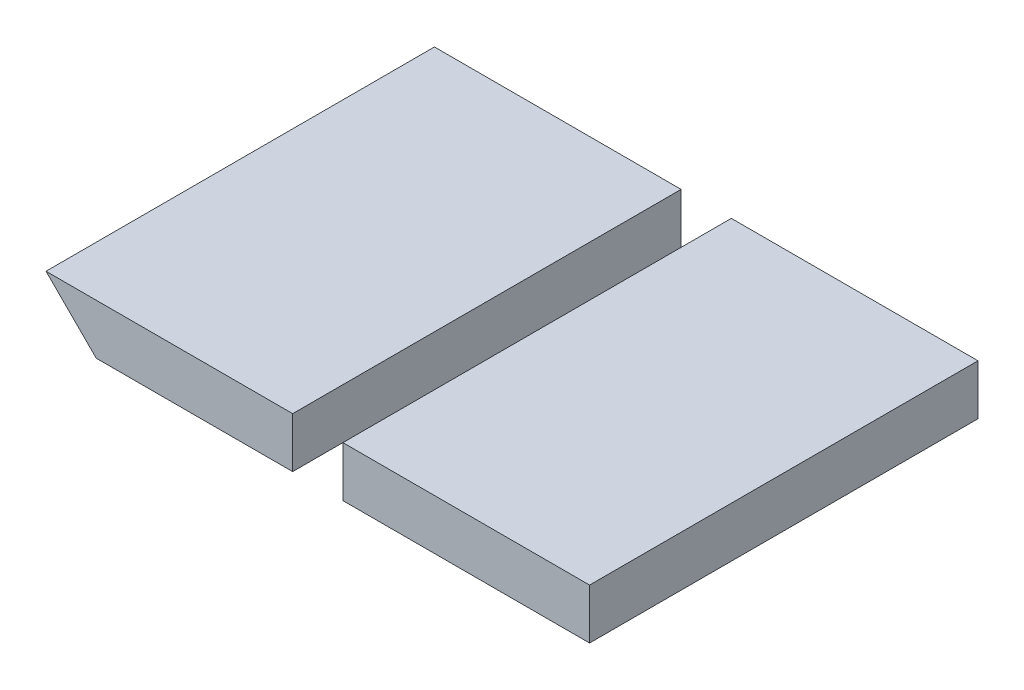
ISO-10303-21;
HEADER;
FILE_DESCRIPTION(('STEP AP214'),'2;1');
FILE_NAME('part.step','',(''),(''),'','','');
FILE_SCHEMA(('AUTOMOTIVE_DESIGN { 1 0 10303 214 1 1 1 1 }'));
ENDSEC;
DATA;
#1=APPLICATION_CONTEXT('core data for automotive mechanical design processes');
#2=APPLICATION_PROTOCOL_DEFINITION('international standard','automotive_design',2000,#1);
#3=PRODUCT_CONTEXT('',#1,'mechanical');
#4=PRODUCT('Part','Part','',(#3));
#5=PRODUCT_RELATED_PRODUCT_CATEGORY('part','',(#4));
#6=PRODUCT_DEFINITION_FORMATION('','',#4);
#7=PRODUCT_DEFINITION_CONTEXT('part definition',#1,'design');
#8=PRODUCT_DEFINITION('design','',#6,#7);
#9=PRODUCT_DEFINITION_SHAPE('','',#8);
#10=(LENGTH_UNIT() NAMED_UNIT(*) SI_UNIT(.MILLI.,.METRE.));
#11=(NAMED_UNIT(*) PLANE_ANGLE_UNIT() SI_UNIT($,.RADIAN.));
#12=(NAMED_UNIT(*) SI_UNIT($,.STERADIAN.) SOLID_ANGLE_UNIT());
#13=UNCERTAINTY_MEASURE_WITH_UNIT(LENGTH_MEASURE(1.E-05),#10,'distance_accuracy_value','');
#14=(GEOMETRIC_REPRESENTATION_CONTEXT(3) GLOBAL_UNCERTAINTY_ASSIGNED_CONTEXT((#13)) GLOBAL_UNIT_ASSIGNED_CONTEXT((#10,
#11,#12)) REPRESENTATION_CONTEXT('',''));
#15=CARTESIAN_POINT('',(0.,0.,0.));
#16=DIRECTION('',(0.,0.,1.));
#17=DIRECTION('',(1.,0.,0.));
#18=AXIS2_PLACEMENT_3D('',#15,#16,#17);
#19=CARTESIAN_POINT('',(6.34999999999997,0.,20.));
#20=DIRECTION('',(1.,0.,0.));
#21=DIRECTION('',(0.,1.,0.));
#22=AXIS2_PLACEMENT_3D('',#19,#20,#21);
#23=PLANE('',#22);
#24=DIRECTION('',(0.,-1.,0.));
#25=VECTOR('',#24,1.);
#26=CARTESIAN_POINT('',(6.34999999999997,0.,0.));
#27=LINE('',#26,#25);
#28=CARTESIAN_POINT('',(6.35,21.6361,0.));
#29=VERTEX_POINT('',#28);
#30=CARTESIAN_POINT('',(6.35,19.05,0.));
#31=VERTEX_POINT('',#30);
#32=EDGE_CURVE('E120',#29,#31,#27,.T.);
#33=ORIENTED_EDGE('',*,*,#32,.F.);
#34=DIRECTION('',(0.,0.,-1.));
#35=VECTOR('',#34,1.);
#36=CARTESIAN_POINT('',(6.35,21.6361,20.));
#37=LINE('',#36,#35);
#38=CARTESIAN_POINT('',(6.35,21.6361,20.));
#39=VERTEX_POINT('',#38);
#40=EDGE_CURVE('E12',#39,#29,#37,.T.);
#41=ORIENTED_EDGE('',*,*,#40,.F.);
#42=DIRECTION('',(0.,-1.,0.));
#43=VECTOR('',#42,1.);
#44=CARTESIAN_POINT('',(6.34999999999997,0.,20.));
#45=LINE('',#44,#43);
#46=CARTESIAN_POINT('',(6.35,19.05,20.));
#47=VERTEX_POINT('',#46);
#48=EDGE_CURVE('E110',#39,#47,#45,.T.);
#49=ORIENTED_EDGE('',*,*,#48,.T.);
#50=DIRECTION('',(0.,0.,-1.));
#51=VECTOR('',#50,1.);
#52=CARTESIAN_POINT('',(6.35,19.05,20.));
#53=LINE('',#52,#51);
#54=EDGE_CURVE('E91',#47,#31,#53,.T.);
#55=ORIENTED_EDGE('',*,*,#54,.T.);
#56=EDGE_LOOP('',(#33,#41,#49,#55));
#57=FACE_BOUND('',#56,.T.);
#58=ADVANCED_FACE('F52',(#57),#23,.T.);
#59=CARTESIAN_POINT('',(0.,21.6361,20.));
#60=DIRECTION('',(0.,1.,0.));
#61=DIRECTION('',(-1.,0.,0.));
#62=AXIS2_PLACEMENT_3D('',#59,#60,#61);
#63=PLANE('',#62);
#64=DIRECTION('',(1.,0.,0.));
#65=VECTOR('',#64,1.);
#66=CARTESIAN_POINT('',(0.,21.6361,0.));
#67=LINE('',#66,#65);
#68=CARTESIAN_POINT('',(-6.35,21.6361,0.));
#69=VERTEX_POINT('',#68);
#70=EDGE_CURVE('E102',#69,#29,#67,.T.);
#71=ORIENTED_EDGE('',*,*,#70,.F.);
#72=DIRECTION('',(0.,0.,-1.));
#73=VECTOR('',#72,1.);
#74=CARTESIAN_POINT('',(-6.35,21.6361,20.));
#75=LINE('',#74,#73);
#76=CARTESIAN_POINT('',(-6.35,21.6361,20.));
#77=VERTEX_POINT('',#76);
#78=EDGE_CURVE('E61',#77,#69,#75,.T.);
#79=ORIENTED_EDGE('',*,*,#78,.F.);
#80=DIRECTION('',(1.,0.,0.));
#81=VECTOR('',#80,1.);
#82=CARTESIAN_POINT('',(0.,21.6361,20.));
#83=LINE('',#82,#81);
#84=EDGE_CURVE('E100',#77,#39,#83,.T.);
#85=ORIENTED_EDGE('',*,*,#84,.T.);
#86=ORIENTED_EDGE('',*,*,#40,.T.);
#87=EDGE_LOOP('',(#71,#79,#85,#86));
#88=FACE_BOUND('',#87,.T.);
#89=ADVANCED_FACE('F99',(#88),#63,.T.);
#90=CARTESIAN_POINT('',(-6.35000000000002,0.,20.));
#91=DIRECTION('',(-1.,0.,0.));
#92=DIRECTION('',(0.,-1.,0.));
#93=AXIS2_PLACEMENT_3D('',#90,#91,#92);
#94=PLANE('',#93);
#95=DIRECTION('',(0.,1.,0.));
#96=VECTOR('',#95,1.);
#97=CARTESIAN_POINT('',(-6.35000000000002,0.,0.));
#98=LINE('',#97,#96);
#99=CARTESIAN_POINT('',(-6.35,19.05,0.));
#100=VERTEX_POINT('',#99);
#101=EDGE_CURVE('E126',#100,#69,#98,.T.);
#102=ORIENTED_EDGE('',*,*,#101,.F.);
#103=DIRECTION('',(0.,0.,-1.));
#104=VECTOR('',#103,1.);
#105=CARTESIAN_POINT('',(-6.35,19.05,20.));
#106=LINE('',#105,#104);
#107=CARTESIAN_POINT('',(-6.35,19.05,20.));
#108=VERTEX_POINT('',#107);
#109=EDGE_CURVE('E84',#108,#100,#106,.T.);
#110=ORIENTED_EDGE('',*,*,#109,.F.);
#111=DIRECTION('',(0.,1.,0.));
#112=VECTOR('',#111,1.);
#113=CARTESIAN_POINT('',(-6.35000000000002,0.,20.));
#114=LINE('',#113,#112);
#115=EDGE_CURVE('E109',#108,#77,#114,.T.);
#116=ORIENTED_EDGE('',*,*,#115,.T.);
#117=ORIENTED_EDGE('',*,*,#78,.T.);
#118=EDGE_LOOP('',(#102,#110,#116,#117));
#119=FACE_BOUND('',#118,.T.);
#120=ADVANCED_FACE('F113',(#119),#94,.T.);
#121=CARTESIAN_POINT('',(0.,19.05,20.));
#122=DIRECTION('',(0.,1.,0.));
#123=DIRECTION('',(0.,0.,1.));
#124=AXIS2_PLACEMENT_3D('',#121,#122,#123);
#125=PLANE('',#124);
#126=DIRECTION('',(1.,0.,0.));
#127=VECTOR('',#126,1.);
#128=CARTESIAN_POINT('',(0.,19.05,0.));
#129=LINE('',#128,#127);
#130=EDGE_CURVE('E129',#100,#31,#129,.T.);
#131=ORIENTED_EDGE('',*,*,#130,.T.);
#132=ORIENTED_EDGE('',*,*,#54,.F.);
#133=DIRECTION('',(1.,0.,0.));
#134=VECTOR('',#133,1.);
#135=CARTESIAN_POINT('',(0.,19.05,20.));
#136=LINE('',#135,#134);
#137=EDGE_CURVE('E69',#108,#47,#136,.T.);
#138=ORIENTED_EDGE('',*,*,#137,.F.);
#139=ORIENTED_EDGE('',*,*,#109,.T.);
#140=EDGE_LOOP('',(#131,#132,#138,#139));
#141=FACE_BOUND('',#140,.T.);
#142=ADVANCED_FACE('F143',(#141),#125,.F.);
#143=CARTESIAN_POINT('',(0.,0.,20.));
#144=DIRECTION('',(0.,0.,1.));
#145=DIRECTION('',(1.,0.,0.));
#146=AXIS2_PLACEMENT_3D('',#143,#144,#145);
#147=PLANE('',#146);
#148=ORIENTED_EDGE('',*,*,#48,.F.);
#149=ORIENTED_EDGE('',*,*,#84,.F.);
#150=ORIENTED_EDGE('',*,*,#115,.F.);
#151=ORIENTED_EDGE('',*,*,#137,.T.);
#152=EDGE_LOOP('',(#148,#149,#150,#151));
#153=FACE_BOUND('',#152,.T.);
#154=ADVANCED_FACE('F108',(#153),#147,.T.);
#155=CARTESIAN_POINT('',(0.,0.,0.));
#156=DIRECTION('',(0.,0.,1.));
#157=DIRECTION('',(1.,0.,0.));
#158=AXIS2_PLACEMENT_3D('',#155,#156,#157);
#159=PLANE('',#158);
#160=ORIENTED_EDGE('',*,*,#32,.T.);
#161=ORIENTED_EDGE('',*,*,#130,.F.);
#162=ORIENTED_EDGE('',*,*,#101,.T.);
#163=ORIENTED_EDGE('',*,*,#70,.T.);
#164=EDGE_LOOP('',(#160,#161,#162,#163));
#165=FACE_BOUND('',#164,.T.);
#166=ADVANCED_FACE('F148',(#165),#159,.F.);
#167=CLOSED_SHELL('',(#58,#89,#120,#142,#154,#166));
#168=MANIFOLD_SOLID_BREP('B2_NOT_SHOWN',#167);
#169=CARTESIAN_POINT('',(-8.93610000000002,0.,20.));
#170=DIRECTION('',(1.,0.,0.));
#171=DIRECTION('',(0.,1.,0.));
#172=AXIS2_PLACEMENT_3D('',#169,#170,#171);
#173=PLANE('',#172);
#174=DIRECTION('',(0.,-1.,0.));
#175=VECTOR('',#174,1.);
#176=CARTESIAN_POINT('',(-8.93610000000002,0.,0.));
#177=LINE('',#176,#175);
#178=CARTESIAN_POINT('',(-8.9361,21.6361,0.));
#179=VERTEX_POINT('',#178);
#180=CARTESIAN_POINT('',(-8.9361,19.05,0.));
#181=VERTEX_POINT('',#180);
#182=EDGE_CURVE('E253',#179,#181,#177,.T.);
#183=ORIENTED_EDGE('',*,*,#182,.F.);
#184=DIRECTION('',(0.,0.,-1.));
#185=VECTOR('',#184,1.);
#186=CARTESIAN_POINT('',(-8.9361,21.6361,20.));
#187=LINE('',#186,#185);
#188=CARTESIAN_POINT('',(-8.9361,21.6361,20.));
#189=VERTEX_POINT('',#188);
#190=EDGE_CURVE('E50',#189,#179,#187,.T.);
#191=ORIENTED_EDGE('',*,*,#190,.F.);
#192=DIRECTION('',(0.,-1.,0.));
#193=VECTOR('',#192,1.);
#194=CARTESIAN_POINT('',(-8.93610000000002,0.,20.));
#195=LINE('',#194,#193);
#196=CARTESIAN_POINT('',(-8.9361,19.05,20.));
#197=VERTEX_POINT('',#196);
#198=EDGE_CURVE('E247',#189,#197,#195,.T.);
#199=ORIENTED_EDGE('',*,*,#198,.T.);
#200=DIRECTION('',(0.,0.,-1.));
#201=VECTOR('',#200,1.);
#202=CARTESIAN_POINT('',(-8.9361,19.05,20.));
#203=LINE('',#202,#201);
#204=EDGE_CURVE('E228',#197,#181,#203,.T.);
#205=ORIENTED_EDGE('',*,*,#204,.T.);
#206=EDGE_LOOP('',(#183,#191,#199,#205));
#207=FACE_BOUND('',#206,.T.);
#208=ADVANCED_FACE('F190',(#207),#173,.T.);
#209=CARTESIAN_POINT('',(0.,21.6361,20.));
#210=DIRECTION('',(0.,1.,0.));
#211=DIRECTION('',(-1.,0.,0.));
#212=AXIS2_PLACEMENT_3D('',#209,#210,#211);
#213=PLANE('',#212);
#214=DIRECTION('',(1.,0.,0.));
#215=VECTOR('',#214,1.);
#216=CARTESIAN_POINT('',(0.,21.6361,0.));
#217=LINE('',#216,#215);
#218=CARTESIAN_POINT('',(-21.6361,21.6361,0.));
#219=VERTEX_POINT('',#218);
#220=EDGE_CURVE('E241',#219,#179,#217,.T.);
#221=ORIENTED_EDGE('',*,*,#220,.F.);
#222=DIRECTION('',(0.,0.,-1.));
#223=VECTOR('',#222,1.);
#224=CARTESIAN_POINT('',(-21.6361,21.6361,20.));
#225=LINE('',#224,#223);
#226=CARTESIAN_POINT('',(-21.6361,21.6361,20.));
#227=VERTEX_POINT('',#226);
#228=EDGE_CURVE('E198',#227,#219,#225,.T.);
#229=ORIENTED_EDGE('',*,*,#228,.F.);
#230=DIRECTION('',(1.,0.,0.));
#231=VECTOR('',#230,1.);
#232=CARTESIAN_POINT('',(0.,21.6361,20.));
#233=LINE('',#232,#231);
#234=EDGE_CURVE('E239',#227,#189,#233,.T.);
#235=ORIENTED_EDGE('',*,*,#234,.T.);
#236=ORIENTED_EDGE('',*,*,#190,.T.);
#237=EDGE_LOOP('',(#221,#229,#235,#236));
#238=FACE_BOUND('',#237,.T.);
#239=ADVANCED_FACE('F237',(#238),#213,.T.);
#240=CARTESIAN_POINT('',(0.,0.,20.));
#241=DIRECTION('',(0.707106781186547,0.707106781186548,0.));
#242=DIRECTION('',(-0.707106781186548,0.707106781186547,0.));
#243=AXIS2_PLACEMENT_3D('',#240,#241,#242);
#244=PLANE('',#243);
#245=DIRECTION('',(0.707106781186548,-0.707106781186547,0.));
#246=VECTOR('',#245,1.);
#247=CARTESIAN_POINT('',(0.,0.,0.));
#248=LINE('',#247,#246);
#249=CARTESIAN_POINT('',(-19.05,19.05,0.));
#250=VERTEX_POINT('',#249);
#251=EDGE_CURVE('E221',#219,#250,#248,.T.);
#252=ORIENTED_EDGE('',*,*,#251,.T.);
#253=DIRECTION('',(0.,0.,-1.));
#254=VECTOR('',#253,1.);
#255=CARTESIAN_POINT('',(-19.05,19.05,20.));
#256=LINE('',#255,#254);
#257=CARTESIAN_POINT('',(-19.05,19.05,20.));
#258=VERTEX_POINT('',#257);
#259=EDGE_CURVE('E242',#258,#250,#256,.T.);
#260=ORIENTED_EDGE('',*,*,#259,.F.);
#261=DIRECTION('',(0.707106781186548,-0.707106781186547,0.));
#262=VECTOR('',#261,1.);
#263=CARTESIAN_POINT('',(0.,0.,20.));
#264=LINE('',#263,#262);
#265=EDGE_CURVE('E243',#227,#258,#264,.T.);
#266=ORIENTED_EDGE('',*,*,#265,.F.);
#267=ORIENTED_EDGE('',*,*,#228,.T.);
#268=EDGE_LOOP('',(#252,#260,#266,#267));
#269=FACE_BOUND('',#268,.T.);
#270=ADVANCED_FACE('F244',(#269),#244,.F.);
#271=CARTESIAN_POINT('',(0.,19.05,20.));
#272=DIRECTION('',(0.,1.,0.));
#273=DIRECTION('',(0.,0.,1.));
#274=AXIS2_PLACEMENT_3D('',#271,#272,#273);
#275=PLANE('',#274);
#276=DIRECTION('',(1.,0.,0.));
#277=VECTOR('',#276,1.);
#278=CARTESIAN_POINT('',(0.,19.05,0.));
#279=LINE('',#278,#277);
#280=EDGE_CURVE('E249',#250,#181,#279,.T.);
#281=ORIENTED_EDGE('',*,*,#280,.T.);
#282=ORIENTED_EDGE('',*,*,#204,.F.);
#283=DIRECTION('',(1.,0.,0.));
#284=VECTOR('',#283,1.);
#285=CARTESIAN_POINT('',(0.,19.05,20.));
#286=LINE('',#285,#284);
#287=EDGE_CURVE('E206',#258,#197,#286,.T.);
#288=ORIENTED_EDGE('',*,*,#287,.F.);
#289=ORIENTED_EDGE('',*,*,#259,.T.);
#290=EDGE_LOOP('',(#281,#282,#288,#289));
#291=FACE_BOUND('',#290,.T.);
#292=ADVANCED_FACE('F262',(#291),#275,.F.);
#293=CARTESIAN_POINT('',(0.,0.,20.));
#294=DIRECTION('',(0.,0.,1.));
#295=DIRECTION('',(1.,0.,0.));
#296=AXIS2_PLACEMENT_3D('',#293,#294,#295);
#297=PLANE('',#296);
#298=ORIENTED_EDGE('',*,*,#198,.F.);
#299=ORIENTED_EDGE('',*,*,#234,.F.);
#300=ORIENTED_EDGE('',*,*,#265,.T.);
#301=ORIENTED_EDGE('',*,*,#287,.T.);
#302=EDGE_LOOP('',(#298,#299,#300,#301));
#303=FACE_BOUND('',#302,.T.);
#304=ADVANCED_FACE('F246',(#303),#297,.T.);
#305=CARTESIAN_POINT('',(0.,0.,0.));
#306=DIRECTION('',(0.,0.,1.));
#307=DIRECTION('',(1.,0.,0.));
#308=AXIS2_PLACEMENT_3D('',#305,#306,#307);
#309=PLANE('',#308);
#310=ORIENTED_EDGE('',*,*,#182,.T.);
#311=ORIENTED_EDGE('',*,*,#280,.F.);
#312=ORIENTED_EDGE('',*,*,#251,.F.);
#313=ORIENTED_EDGE('',*,*,#220,.T.);
#314=EDGE_LOOP('',(#310,#311,#312,#313));
#315=FACE_BOUND('',#314,.T.);
#316=ADVANCED_FACE('F264',(#315),#309,.F.);
#317=CLOSED_SHELL('',(#208,#239,#270,#292,#304,#316));
#318=MANIFOLD_SOLID_BREP('B6',#317);
#319=ADVANCED_BREP_SHAPE_REPRESENTATION('',(#18,#168,#318),#14);
#320=SHAPE_DEFINITION_REPRESENTATION(#9,#319);
ENDSEC;
END-ISO-10303-21;
